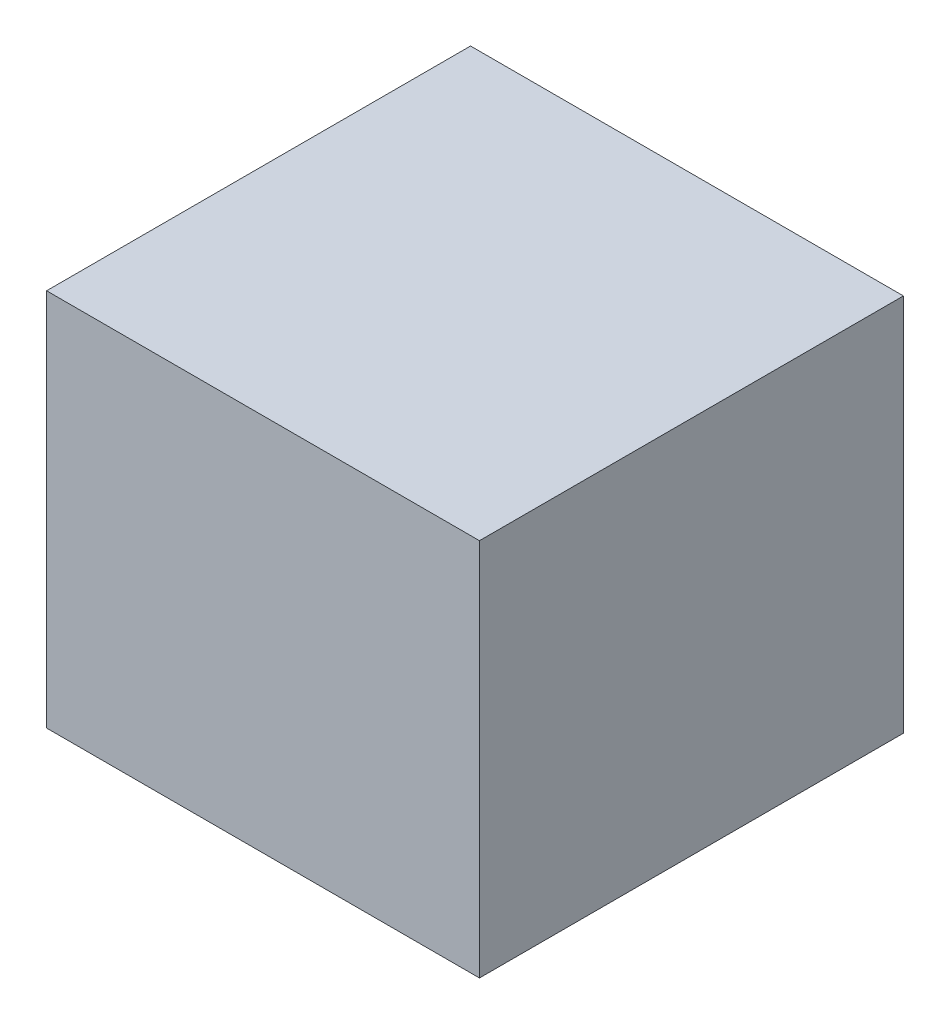
ISO-10303-21;
HEADER;
FILE_DESCRIPTION(('STEP AP214'),'2;1');
FILE_NAME('part.step','',(''),(''),'','','');
FILE_SCHEMA(('AUTOMOTIVE_DESIGN { 1 0 10303 214 1 1 1 1 }'));
ENDSEC;
DATA;
#1=APPLICATION_CONTEXT('core data for automotive mechanical design processes');
#2=APPLICATION_PROTOCOL_DEFINITION('international standard','automotive_design',2000,#1);
#3=PRODUCT_CONTEXT('',#1,'mechanical');
#4=PRODUCT('Part','Part','',(#3));
#5=PRODUCT_RELATED_PRODUCT_CATEGORY('part','',(#4));
#6=PRODUCT_DEFINITION_FORMATION('','',#4);
#7=PRODUCT_DEFINITION_CONTEXT('part definition',#1,'design');
#8=PRODUCT_DEFINITION('design','',#6,#7);
#9=PRODUCT_DEFINITION_SHAPE('','',#8);
#10=(LENGTH_UNIT() NAMED_UNIT(*) SI_UNIT(.MILLI.,.METRE.));
#11=(NAMED_UNIT(*) PLANE_ANGLE_UNIT() SI_UNIT($,.RADIAN.));
#12=(NAMED_UNIT(*) SI_UNIT($,.STERADIAN.) SOLID_ANGLE_UNIT());
#13=UNCERTAINTY_MEASURE_WITH_UNIT(LENGTH_MEASURE(1.E-05),#10,'distance_accuracy_value','');
#14=(GEOMETRIC_REPRESENTATION_CONTEXT(3) GLOBAL_UNCERTAINTY_ASSIGNED_CONTEXT((#13)) GLOBAL_UNIT_ASSIGNED_CONTEXT((#10,
#11,#12)) REPRESENTATION_CONTEXT('',''));
#15=CARTESIAN_POINT('',(0.,0.,0.));
#16=DIRECTION('',(0.,0.,1.));
#17=DIRECTION('',(1.,0.,0.));
#18=AXIS2_PLACEMENT_3D('',#15,#16,#17);
#19=CARTESIAN_POINT('',(-13.6584716132696,-29.1748546534807,27.0758726873685));
#20=DIRECTION('',(0.,0.,-1.));
#21=DIRECTION('',(-1.,0.,0.));
#22=AXIS2_PLACEMENT_3D('',#19,#20,#21);
#23=PLANE('',#22);
#24=DIRECTION('',(0.,-1.,0.));
#25=VECTOR('',#24,1.);
#26=CARTESIAN_POINT('',(-13.7934716132696,-29.1748546534807,27.0758726873685));
#27=LINE('',#26,#25);
#28=CARTESIAN_POINT('',(-13.7934716132696,-29.0567407060883,27.0758726873685));
#29=VERTEX_POINT('',#28);
#30=CARTESIAN_POINT('',(-13.7934716132696,-29.1748546534807,27.0758726873685));
#31=VERTEX_POINT('',#30);
#32=EDGE_CURVE('E96',#29,#31,#27,.T.);
#33=ORIENTED_EDGE('',*,*,#32,.T.);
#34=DIRECTION('',(-1.,0.,0.));
#35=VECTOR('',#34,1.);
#36=CARTESIAN_POINT('',(-13.6584716132696,-29.1748546534807,27.0758726873685));
#37=LINE('',#36,#35);
#38=CARTESIAN_POINT('',(-13.6584716132696,-29.1748546534807,27.0758726873685));
#39=VERTEX_POINT('',#38);
#40=EDGE_CURVE('E11',#39,#31,#37,.T.);
#41=ORIENTED_EDGE('',*,*,#40,.F.);
#42=DIRECTION('',(0.,-1.,0.));
#43=VECTOR('',#42,1.);
#44=CARTESIAN_POINT('',(-13.6584716132696,-29.1748546534807,27.0758726873685));
#45=LINE('',#44,#43);
#46=CARTESIAN_POINT('',(-13.6584716132696,-29.0567407060883,27.0758726873685));
#47=VERTEX_POINT('',#46);
#48=EDGE_CURVE('E84',#47,#39,#45,.T.);
#49=ORIENTED_EDGE('',*,*,#48,.F.);
#50=DIRECTION('',(-1.,0.,0.));
#51=VECTOR('',#50,1.);
#52=CARTESIAN_POINT('',(-13.6584716132696,-29.0567407060883,27.0758726873685));
#53=LINE('',#52,#51);
#54=EDGE_CURVE('E92',#47,#29,#53,.T.);
#55=ORIENTED_EDGE('',*,*,#54,.T.);
#56=EDGE_LOOP('',(#33,#41,#49,#55));
#57=FACE_BOUND('',#56,.T.);
#58=ADVANCED_FACE('F33',(#57),#23,.F.);
#59=CARTESIAN_POINT('',(-13.6584716132696,-29.1748546534807,27.0758726873685));
#60=DIRECTION('',(0.,1.,0.));
#61=DIRECTION('',(0.,0.,1.));
#62=AXIS2_PLACEMENT_3D('',#59,#60,#61);
#63=PLANE('',#62);
#64=DIRECTION('',(0.,0.,-1.));
#65=VECTOR('',#64,1.);
#66=CARTESIAN_POINT('',(-13.7934716132696,-29.1748546534807,27.0758726873685));
#67=LINE('',#66,#65);
#68=CARTESIAN_POINT('',(-13.7934716132696,-29.1748546534807,26.9436555820786));
#69=VERTEX_POINT('',#68);
#70=EDGE_CURVE('E88',#31,#69,#67,.T.);
#71=ORIENTED_EDGE('',*,*,#70,.T.);
#72=DIRECTION('',(-1.,0.,0.));
#73=VECTOR('',#72,1.);
#74=CARTESIAN_POINT('',(-13.6584716132696,-29.1748546534807,26.9436555820786));
#75=LINE('',#74,#73);
#76=CARTESIAN_POINT('',(-13.6584716132696,-29.1748546534807,26.9436555820786));
#77=VERTEX_POINT('',#76);
#78=EDGE_CURVE('E41',#77,#69,#75,.T.);
#79=ORIENTED_EDGE('',*,*,#78,.F.);
#80=DIRECTION('',(0.,0.,-1.));
#81=VECTOR('',#80,1.);
#82=CARTESIAN_POINT('',(-13.6584716132696,-29.1748546534807,27.0758726873685));
#83=LINE('',#82,#81);
#84=EDGE_CURVE('E79',#39,#77,#83,.T.);
#85=ORIENTED_EDGE('',*,*,#84,.F.);
#86=ORIENTED_EDGE('',*,*,#40,.T.);
#87=EDGE_LOOP('',(#71,#79,#85,#86));
#88=FACE_BOUND('',#87,.T.);
#89=ADVANCED_FACE('F87',(#88),#63,.F.);
#90=CARTESIAN_POINT('',(-13.6584716132696,-29.1748546534807,26.9436555820786));
#91=DIRECTION('',(0.,0.,1.));
#92=DIRECTION('',(1.,0.,0.));
#93=AXIS2_PLACEMENT_3D('',#90,#91,#92);
#94=PLANE('',#93);
#95=DIRECTION('',(0.,1.,0.));
#96=VECTOR('',#95,1.);
#97=CARTESIAN_POINT('',(-13.7934716132696,-29.1748546534807,26.9436555820786));
#98=LINE('',#97,#96);
#99=CARTESIAN_POINT('',(-13.7934716132696,-29.0567407060883,26.9436555820786));
#100=VERTEX_POINT('',#99);
#101=EDGE_CURVE('E66',#69,#100,#98,.T.);
#102=ORIENTED_EDGE('',*,*,#101,.T.);
#103=DIRECTION('',(-1.,0.,0.));
#104=VECTOR('',#103,1.);
#105=CARTESIAN_POINT('',(-13.6584716132696,-29.0567407060883,26.9436555820786));
#106=LINE('',#105,#104);
#107=CARTESIAN_POINT('',(-13.6584716132696,-29.0567407060883,26.9436555820786));
#108=VERTEX_POINT('',#107);
#109=EDGE_CURVE('E89',#108,#100,#106,.T.);
#110=ORIENTED_EDGE('',*,*,#109,.F.);
#111=DIRECTION('',(0.,1.,0.));
#112=VECTOR('',#111,1.);
#113=CARTESIAN_POINT('',(-13.6584716132696,-29.1748546534807,26.9436555820786));
#114=LINE('',#113,#112);
#115=EDGE_CURVE('E82',#77,#108,#114,.T.);
#116=ORIENTED_EDGE('',*,*,#115,.F.);
#117=ORIENTED_EDGE('',*,*,#78,.T.);
#118=EDGE_LOOP('',(#102,#110,#116,#117));
#119=FACE_BOUND('',#118,.T.);
#120=ADVANCED_FACE('F90',(#119),#94,.F.);
#121=CARTESIAN_POINT('',(-13.6584716132696,-29.0567407060883,27.0758726873685));
#122=DIRECTION('',(0.,-1.,0.));
#123=DIRECTION('',(0.,0.,-1.));
#124=AXIS2_PLACEMENT_3D('',#121,#122,#123);
#125=PLANE('',#124);
#126=DIRECTION('',(0.,0.,1.));
#127=VECTOR('',#126,1.);
#128=CARTESIAN_POINT('',(-13.7934716132696,-29.0567407060883,27.0758726873685));
#129=LINE('',#128,#127);
#130=EDGE_CURVE('E72',#100,#29,#129,.T.);
#131=ORIENTED_EDGE('',*,*,#130,.T.);
#132=ORIENTED_EDGE('',*,*,#54,.F.);
#133=DIRECTION('',(0.,0.,1.));
#134=VECTOR('',#133,1.);
#135=CARTESIAN_POINT('',(-13.6584716132696,-29.0567407060883,27.0758726873685));
#136=LINE('',#135,#134);
#137=EDGE_CURVE('E49',#108,#47,#136,.T.);
#138=ORIENTED_EDGE('',*,*,#137,.F.);
#139=ORIENTED_EDGE('',*,*,#109,.T.);
#140=EDGE_LOOP('',(#131,#132,#138,#139));
#141=FACE_BOUND('',#140,.T.);
#142=ADVANCED_FACE('F103',(#141),#125,.F.);
#143=CARTESIAN_POINT('',(-13.6584716132696,0.,0.));
#144=DIRECTION('',(-1.,0.,0.));
#145=DIRECTION('',(0.,0.,1.));
#146=AXIS2_PLACEMENT_3D('',#143,#144,#145);
#147=PLANE('',#146);
#148=ORIENTED_EDGE('',*,*,#48,.T.);
#149=ORIENTED_EDGE('',*,*,#84,.T.);
#150=ORIENTED_EDGE('',*,*,#115,.T.);
#151=ORIENTED_EDGE('',*,*,#137,.T.);
#152=EDGE_LOOP('',(#148,#149,#150,#151));
#153=FACE_BOUND('',#152,.T.);
#154=ADVANCED_FACE('F80',(#153),#147,.F.);
#155=CARTESIAN_POINT('',(-13.7934716132696,0.,0.));
#156=DIRECTION('',(-1.,0.,0.));
#157=DIRECTION('',(0.,0.,1.));
#158=AXIS2_PLACEMENT_3D('',#155,#156,#157);
#159=PLANE('',#158);
#160=ORIENTED_EDGE('',*,*,#32,.F.);
#161=ORIENTED_EDGE('',*,*,#130,.F.);
#162=ORIENTED_EDGE('',*,*,#101,.F.);
#163=ORIENTED_EDGE('',*,*,#70,.F.);
#164=EDGE_LOOP('',(#160,#161,#162,#163));
#165=FACE_BOUND('',#164,.T.);
#166=ADVANCED_FACE('F106',(#165),#159,.T.);
#167=CLOSED_SHELL('',(#58,#89,#120,#142,#154,#166));
#168=MANIFOLD_SOLID_BREP('B2',#167);
#169=ADVANCED_BREP_SHAPE_REPRESENTATION('',(#18,#168),#14);
#170=SHAPE_DEFINITION_REPRESENTATION(#9,#169);
ENDSEC;
END-ISO-10303-21;
